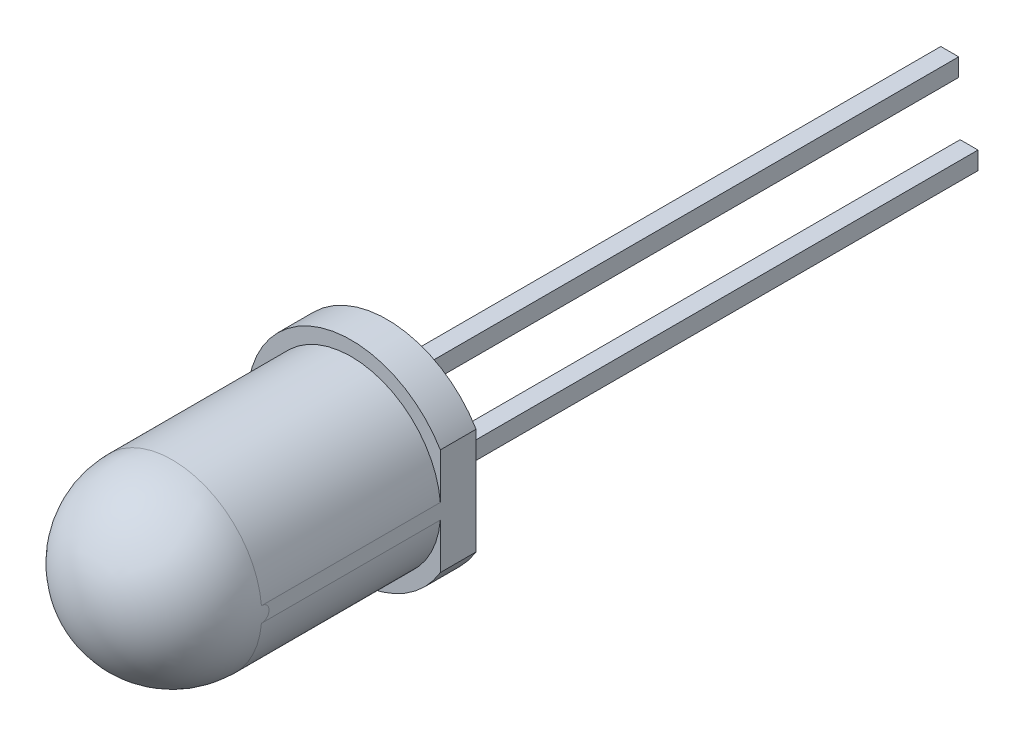
ISO-10303-21;
HEADER;
FILE_DESCRIPTION(('STEP AP214'),'2;1');
FILE_NAME('part.step','',(''),(''),'','','');
FILE_SCHEMA(('AUTOMOTIVE_DESIGN { 1 0 10303 214 1 1 1 1 }'));
ENDSEC;
DATA;
#1=APPLICATION_CONTEXT('core data for automotive mechanical design processes');
#2=APPLICATION_PROTOCOL_DEFINITION('international standard','automotive_design',2000,#1);
#3=PRODUCT_CONTEXT('',#1,'mechanical');
#4=PRODUCT('Part','Part','',(#3));
#5=PRODUCT_RELATED_PRODUCT_CATEGORY('part','',(#4));
#6=PRODUCT_DEFINITION_FORMATION('','',#4);
#7=PRODUCT_DEFINITION_CONTEXT('part definition',#1,'design');
#8=PRODUCT_DEFINITION('design','',#6,#7);
#9=PRODUCT_DEFINITION_SHAPE('','',#8);
#10=(LENGTH_UNIT() NAMED_UNIT(*) SI_UNIT(.MILLI.,.METRE.));
#11=(NAMED_UNIT(*) PLANE_ANGLE_UNIT() SI_UNIT($,.RADIAN.));
#12=(NAMED_UNIT(*) SI_UNIT($,.STERADIAN.) SOLID_ANGLE_UNIT());
#13=UNCERTAINTY_MEASURE_WITH_UNIT(LENGTH_MEASURE(1.E-05),#10,'distance_accuracy_value','');
#14=(GEOMETRIC_REPRESENTATION_CONTEXT(3) GLOBAL_UNCERTAINTY_ASSIGNED_CONTEXT((#13)) GLOBAL_UNIT_ASSIGNED_CONTEXT((#10,
#11,#12)) REPRESENTATION_CONTEXT('',''));
#15=CARTESIAN_POINT('',(0.,0.,0.));
#16=DIRECTION('',(0.,0.,1.));
#17=DIRECTION('',(1.,0.,0.));
#18=AXIS2_PLACEMENT_3D('',#15,#16,#17);
#19=CARTESIAN_POINT('',(-0.204530261149625,0.,17.));
#20=DIRECTION('',(0.,0.,1.));
#21=DIRECTION('',(1.,0.,0.));
#22=AXIS2_PLACEMENT_3D('',#19,#20,#21);
#23=PLANE('',#22);
#24=DIRECTION('',(0.,1.,0.));
#25=VECTOR('',#24,1.);
#26=CARTESIAN_POINT('',(1.51997090657932,0.129298151989421,17.));
#27=LINE('',#26,#25);
#28=CARTESIAN_POINT('',(1.51997090657932,-0.241403696021158,17.));
#29=VERTEX_POINT('',#28);
#30=CARTESIAN_POINT('',(1.51997090657932,0.258596303978842,17.));
#31=VERTEX_POINT('',#30);
#32=EDGE_CURVE('E257',#29,#31,#27,.T.);
#33=ORIENTED_EDGE('',*,*,#32,.T.);
#34=DIRECTION('',(-1.,0.,0.));
#35=VECTOR('',#34,1.);
#36=CARTESIAN_POINT('',(0.407720322714848,0.258596303978842,17.));
#37=LINE('',#36,#35);
#38=CARTESIAN_POINT('',(1.01997090657932,0.258596303978842,17.));
#39=VERTEX_POINT('',#38);
#40=EDGE_CURVE('E230',#31,#39,#37,.T.);
#41=ORIENTED_EDGE('',*,*,#40,.T.);
#42=DIRECTION('',(0.,-1.,0.));
#43=VECTOR('',#42,1.);
#44=CARTESIAN_POINT('',(1.01997090657932,-0.120701848010579,17.));
#45=LINE('',#44,#43);
#46=CARTESIAN_POINT('',(1.01997090657932,-0.241403696021158,17.));
#47=VERTEX_POINT('',#46);
#48=EDGE_CURVE('E195',#39,#47,#45,.T.);
#49=ORIENTED_EDGE('',*,*,#48,.T.);
#50=DIRECTION('',(1.,0.,0.));
#51=VECTOR('',#50,1.);
#52=CARTESIAN_POINT('',(0.657720322714848,-0.241403696021158,17.));
#53=LINE('',#52,#51);
#54=EDGE_CURVE('E185',#47,#29,#53,.T.);
#55=ORIENTED_EDGE('',*,*,#54,.T.);
#56=EDGE_LOOP('',(#33,#41,#49,#55));
#57=FACE_BOUND('',#56,.T.);
#58=DIRECTION('',(0.,-1.,0.));
#59=VECTOR('',#58,1.);
#60=CARTESIAN_POINT('',(-1.51999015986441,-0.127499692359835,17.));
#61=LINE('',#60,#59);
#62=CARTESIAN_POINT('',(-1.51999015986441,0.24500061528033,17.));
#63=VERTEX_POINT('',#62);
#64=CARTESIAN_POINT('',(-1.51999015986441,-0.25499938471967,17.));
#65=VERTEX_POINT('',#64);
#66=EDGE_CURVE('E176',#63,#65,#61,.T.);
#67=ORIENTED_EDGE('',*,*,#66,.T.);
#68=DIRECTION('',(1.,0.,0.));
#69=VECTOR('',#68,1.);
#70=CARTESIAN_POINT('',(-0.612260210507016,-0.25499938471967,17.));
#71=LINE('',#70,#69);
#72=CARTESIAN_POINT('',(-1.01999015986441,-0.25499938471967,17.));
#73=VERTEX_POINT('',#72);
#74=EDGE_CURVE('E214',#65,#73,#71,.T.);
#75=ORIENTED_EDGE('',*,*,#74,.T.);
#76=DIRECTION('',(0.,1.,0.));
#77=VECTOR('',#76,1.);
#78=CARTESIAN_POINT('',(-1.01999015986441,0.122500307640165,17.));
#79=LINE('',#78,#77);
#80=CARTESIAN_POINT('',(-1.01999015986441,0.24500061528033,17.));
#81=VERTEX_POINT('',#80);
#82=EDGE_CURVE('E246',#73,#81,#79,.T.);
#83=ORIENTED_EDGE('',*,*,#82,.T.);
#84=DIRECTION('',(-1.,0.,0.));
#85=VECTOR('',#84,1.);
#86=CARTESIAN_POINT('',(-0.862260210507016,0.24500061528033,17.));
#87=LINE('',#86,#85);
#88=EDGE_CURVE('E262',#81,#63,#87,.T.);
#89=ORIENTED_EDGE('',*,*,#88,.T.);
#90=EDGE_LOOP('',(#67,#75,#83,#89));
#91=FACE_BOUND('',#90,.T.);
#92=CARTESIAN_POINT('',(0.,0.,17.));
#93=DIRECTION('',(0.,0.,1.));
#94=DIRECTION('',(1.,0.,0.));
#95=AXIS2_PLACEMENT_3D('',#92,#93,#94);
#96=CIRCLE('',#95,2.9);
#97=CARTESIAN_POINT('',(2.49093947770075,1.48499849105375,17.));
#98=VERTEX_POINT('',#97);
#99=CARTESIAN_POINT('',(2.49093947770075,-1.48499849105375,17.));
#100=VERTEX_POINT('',#99);
#101=EDGE_CURVE('E10',#98,#100,#96,.T.);
#102=ORIENTED_EDGE('',*,*,#101,.F.);
#103=DIRECTION('',(0.,1.,0.));
#104=VECTOR('',#103,1.);
#105=CARTESIAN_POINT('',(2.49093947770075,-2.49999994412065,17.));
#106=LINE('',#105,#104);
#107=EDGE_CURVE('E179',#100,#98,#106,.T.);
#108=ORIENTED_EDGE('',*,*,#107,.F.);
#109=EDGE_LOOP('',(#102,#108));
#110=FACE_BOUND('',#109,.T.);
#111=ADVANCED_FACE('F16',(#57,#91,#110),#23,.F.);
#112=CARTESIAN_POINT('',(0.,0.,17.));
#113=DIRECTION('',(0.,0.,1.));
#114=DIRECTION('',(-1.,0.,0.));
#115=AXIS2_PLACEMENT_3D('',#112,#113,#114);
#116=CYLINDRICAL_SURFACE('',#115,2.9);
#117=ORIENTED_EDGE('',*,*,#101,.T.);
#118=DIRECTION('',(0.,0.,1.));
#119=VECTOR('',#118,1.);
#120=CARTESIAN_POINT('',(2.49093947770075,-1.48499849105375,17.));
#121=LINE('',#120,#119);
#122=CARTESIAN_POINT('',(2.49093947770075,-1.48499849105375,18.));
#123=VERTEX_POINT('',#122);
#124=EDGE_CURVE('E156',#100,#123,#121,.T.);
#125=ORIENTED_EDGE('',*,*,#124,.T.);
#126=CARTESIAN_POINT('',(0.,0.,18.));
#127=DIRECTION('',(0.,0.,1.));
#128=DIRECTION('',(1.,0.,0.));
#129=AXIS2_PLACEMENT_3D('',#126,#127,#128);
#130=CIRCLE('',#129,2.9);
#131=CARTESIAN_POINT('',(2.49093947770075,1.48499849105375,18.));
#132=VERTEX_POINT('',#131);
#133=EDGE_CURVE('E153',#132,#123,#130,.T.);
#134=ORIENTED_EDGE('',*,*,#133,.F.);
#135=DIRECTION('',(0.,0.,1.));
#136=VECTOR('',#135,1.);
#137=CARTESIAN_POINT('',(2.49093947770075,1.48499849105375,17.));
#138=LINE('',#137,#136);
#139=EDGE_CURVE('E26',#98,#132,#138,.T.);
#140=ORIENTED_EDGE('',*,*,#139,.F.);
#141=EDGE_LOOP('',(#117,#125,#134,#140));
#142=FACE_BOUND('',#141,.T.);
#143=ADVANCED_FACE('F225',(#142),#116,.T.);
#144=CARTESIAN_POINT('',(2.49093947770075,-1.48499849105375,17.));
#145=DIRECTION('',(1.,0.,0.));
#146=DIRECTION('',(0.,1.,0.));
#147=AXIS2_PLACEMENT_3D('',#144,#145,#146);
#148=PLANE('',#147);
#149=CARTESIAN_POINT('',(2.49093947770075,0.,23.));
#150=DIRECTION('',(-1.,0.,0.));
#151=DIRECTION('',(0.,0.,1.));
#152=AXIS2_PLACEMENT_3D('',#149,#150,#151);
#153=CIRCLE('',#152,0.212651166072309);
#154=CARTESIAN_POINT('',(2.49093947770075,0.212651166072291,23.));
#155=VERTEX_POINT('',#154);
#156=CARTESIAN_POINT('',(2.49093947770075,-0.212651166072285,23.));
#157=VERTEX_POINT('',#156);
#158=EDGE_CURVE('E160',#155,#157,#153,.T.);
#159=ORIENTED_EDGE('',*,*,#158,.T.);
#160=DIRECTION('',(0.,0.,1.));
#161=VECTOR('',#160,1.);
#162=CARTESIAN_POINT('',(2.49093947770075,-0.212651166072285,18.));
#163=LINE('',#162,#161);
#164=CARTESIAN_POINT('',(2.49093947770075,-0.212651166072285,18.));
#165=VERTEX_POINT('',#164);
#166=EDGE_CURVE('E158',#165,#157,#163,.T.);
#167=ORIENTED_EDGE('',*,*,#166,.F.);
#168=DIRECTION('',(0.,1.,0.));
#169=VECTOR('',#168,1.);
#170=CARTESIAN_POINT('',(2.49093947770075,-2.49999994412065,18.));
#171=LINE('',#170,#169);
#172=EDGE_CURVE('E146',#123,#165,#171,.T.);
#173=ORIENTED_EDGE('',*,*,#172,.F.);
#174=ORIENTED_EDGE('',*,*,#124,.F.);
#175=ORIENTED_EDGE('',*,*,#107,.T.);
#176=ORIENTED_EDGE('',*,*,#139,.T.);
#177=DIRECTION('',(0.,1.,0.));
#178=VECTOR('',#177,1.);
#179=CARTESIAN_POINT('',(2.49093947770075,-2.49999994412065,18.));
#180=LINE('',#179,#178);
#181=CARTESIAN_POINT('',(2.49093947770075,0.212651166072291,18.));
#182=VERTEX_POINT('',#181);
#183=EDGE_CURVE('E181',#182,#132,#180,.T.);
#184=ORIENTED_EDGE('',*,*,#183,.F.);
#185=DIRECTION('',(0.,0.,1.));
#186=VECTOR('',#185,1.);
#187=CARTESIAN_POINT('',(2.49093947770075,0.212651166072291,18.));
#188=LINE('',#187,#186);
#189=EDGE_CURVE('E115',#182,#155,#188,.T.);
#190=ORIENTED_EDGE('',*,*,#189,.T.);
#191=EDGE_LOOP('',(#159,#167,#173,#174,#175,#176,#184,#190));
#192=FACE_BOUND('',#191,.T.);
#193=ADVANCED_FACE('F159',(#192),#148,.T.);
#194=CARTESIAN_POINT('',(-0.204530261149625,0.,18.));
#195=DIRECTION('',(0.,0.,1.));
#196=DIRECTION('',(1.,0.,0.));
#197=AXIS2_PLACEMENT_3D('',#194,#195,#196);
#198=PLANE('',#197);
#199=CARTESIAN_POINT('',(0.,0.,18.));
#200=DIRECTION('',(0.,0.,-1.));
#201=DIRECTION('',(-1.,0.,0.));
#202=AXIS2_PLACEMENT_3D('',#199,#200,#201);
#203=CIRCLE('',#202,2.5);
#204=EDGE_CURVE('E151',#165,#182,#203,.T.);
#205=ORIENTED_EDGE('',*,*,#204,.T.);
#206=ORIENTED_EDGE('',*,*,#183,.T.);
#207=ORIENTED_EDGE('',*,*,#133,.T.);
#208=ORIENTED_EDGE('',*,*,#172,.T.);
#209=EDGE_LOOP('',(#205,#206,#207,#208));
#210=FACE_BOUND('',#209,.T.);
#211=ADVANCED_FACE('F148',(#210),#198,.T.);
#212=CARTESIAN_POINT('',(0.,0.,18.));
#213=DIRECTION('',(0.,0.,1.));
#214=DIRECTION('',(-1.,0.,0.));
#215=AXIS2_PLACEMENT_3D('',#212,#213,#214);
#216=CYLINDRICAL_SURFACE('',#215,2.5);
#217=ORIENTED_EDGE('',*,*,#204,.F.);
#218=ORIENTED_EDGE('',*,*,#166,.T.);
#219=CARTESIAN_POINT('',(0.,0.,23.));
#220=DIRECTION('',(0.,0.,1.));
#221=DIRECTION('',(-1.,0.,0.));
#222=AXIS2_PLACEMENT_3D('',#219,#220,#221);
#223=CIRCLE('',#222,2.5);
#224=CARTESIAN_POINT('',(-2.5,0.,23.));
#225=VERTEX_POINT('',#224);
#226=EDGE_CURVE('E126',#225,#157,#223,.T.);
#227=ORIENTED_EDGE('',*,*,#226,.F.);
#228=CARTESIAN_POINT('',(0.,0.,23.));
#229=DIRECTION('',(0.,0.,1.));
#230=DIRECTION('',(-1.,0.,0.));
#231=AXIS2_PLACEMENT_3D('',#228,#229,#230);
#232=CIRCLE('',#231,2.5);
#233=EDGE_CURVE('E208',#155,#225,#232,.T.);
#234=ORIENTED_EDGE('',*,*,#233,.F.);
#235=ORIENTED_EDGE('',*,*,#189,.F.);
#236=EDGE_LOOP('',(#217,#218,#227,#234,#235));
#237=FACE_BOUND('',#236,.T.);
#238=ADVANCED_FACE('F163',(#237),#216,.T.);
#239=CARTESIAN_POINT('',(0.,0.,23.));
#240=DIRECTION('',(0.,0.,1.));
#241=DIRECTION('',(1.,0.,0.));
#242=AXIS2_PLACEMENT_3D('',#239,#240,#241);
#243=SPHERICAL_SURFACE('',#242,2.5);
#244=ORIENTED_EDGE('',*,*,#233,.T.);
#245=CARTESIAN_POINT('',(0.,0.,23.));
#246=DIRECTION('',(0.,-1.,0.));
#247=DIRECTION('',(-1.,0.,0.));
#248=AXIS2_PLACEMENT_3D('',#245,#246,#247);
#249=CIRCLE('',#248,2.5);
#250=CARTESIAN_POINT('',(0.,0.,25.5));
#251=VERTEX_POINT('',#250);
#252=EDGE_CURVE('E206',#251,#225,#249,.T.);
#253=ORIENTED_EDGE('',*,*,#252,.F.);
#254=ORIENTED_EDGE('',*,*,#252,.T.);
#255=ORIENTED_EDGE('',*,*,#226,.T.);
#256=ORIENTED_EDGE('',*,*,#158,.F.);
#257=EDGE_LOOP('',(#244,#253,#254,#255,#256));
#258=FACE_BOUND('',#257,.T.);
#259=ADVANCED_FACE('F362',(#258),#243,.T.);
#260=CARTESIAN_POINT('',(1.26997090657932,0.00859630397884229,2.));
#261=DIRECTION('',(0.,0.,-1.));
#262=DIRECTION('',(0.,-1.,0.));
#263=AXIS2_PLACEMENT_3D('',#260,#261,#262);
#264=PLANE('',#263);
#265=DIRECTION('',(-1.,0.,0.));
#266=VECTOR('',#265,1.);
#267=CARTESIAN_POINT('',(1.01997090657932,-0.241403696021158,2.));
#268=LINE('',#267,#266);
#269=CARTESIAN_POINT('',(1.51997090657932,-0.241403696021158,2.));
#270=VERTEX_POINT('',#269);
#271=CARTESIAN_POINT('',(1.01997090657932,-0.241403696021158,2.));
#272=VERTEX_POINT('',#271);
#273=EDGE_CURVE('E19',#270,#272,#268,.T.);
#274=ORIENTED_EDGE('',*,*,#273,.T.);
#275=DIRECTION('',(0.,1.,0.));
#276=VECTOR('',#275,1.);
#277=CARTESIAN_POINT('',(1.01997090657932,0.258596303978842,2.));
#278=LINE('',#277,#276);
#279=CARTESIAN_POINT('',(1.01997090657932,0.258596303978842,2.));
#280=VERTEX_POINT('',#279);
#281=EDGE_CURVE('E186',#272,#280,#278,.T.);
#282=ORIENTED_EDGE('',*,*,#281,.T.);
#283=DIRECTION('',(1.,0.,0.));
#284=VECTOR('',#283,1.);
#285=CARTESIAN_POINT('',(1.51997090657932,0.258596303978842,2.));
#286=LINE('',#285,#284);
#287=CARTESIAN_POINT('',(1.51997090657932,0.258596303978842,2.));
#288=VERTEX_POINT('',#287);
#289=EDGE_CURVE('E234',#280,#288,#286,.T.);
#290=ORIENTED_EDGE('',*,*,#289,.T.);
#291=DIRECTION('',(0.,-1.,0.));
#292=VECTOR('',#291,1.);
#293=CARTESIAN_POINT('',(1.51997090657932,-0.241403696021158,2.));
#294=LINE('',#293,#292);
#295=EDGE_CURVE('E256',#288,#270,#294,.T.);
#296=ORIENTED_EDGE('',*,*,#295,.T.);
#297=EDGE_LOOP('',(#274,#282,#290,#296));
#298=FACE_BOUND('',#297,.T.);
#299=ADVANCED_FACE('F351',(#298),#264,.T.);
#300=CARTESIAN_POINT('',(1.51997090657932,-0.241403696021158,17.));
#301=DIRECTION('',(0.,-1.,0.));
#302=DIRECTION('',(0.,0.,-1.));
#303=AXIS2_PLACEMENT_3D('',#300,#301,#302);
#304=PLANE('',#303);
#305=ORIENTED_EDGE('',*,*,#54,.F.);
#306=DIRECTION('',(0.,0.,-1.));
#307=VECTOR('',#306,1.);
#308=CARTESIAN_POINT('',(1.01997090657932,-0.241403696021158,17.));
#309=LINE('',#308,#307);
#310=EDGE_CURVE('E182',#47,#272,#309,.T.);
#311=ORIENTED_EDGE('',*,*,#310,.T.);
#312=ORIENTED_EDGE('',*,*,#273,.F.);
#313=DIRECTION('',(0.,0.,-1.));
#314=VECTOR('',#313,1.);
#315=CARTESIAN_POINT('',(1.51997090657932,-0.241403696021158,17.));
#316=LINE('',#315,#314);
#317=EDGE_CURVE('E261',#29,#270,#316,.T.);
#318=ORIENTED_EDGE('',*,*,#317,.F.);
#319=EDGE_LOOP('',(#305,#311,#312,#318));
#320=FACE_BOUND('',#319,.T.);
#321=ADVANCED_FACE('F344',(#320),#304,.T.);
#322=CARTESIAN_POINT('',(1.01997090657932,-0.241403696021158,17.));
#323=DIRECTION('',(-1.,0.,0.));
#324=DIRECTION('',(0.,0.,1.));
#325=AXIS2_PLACEMENT_3D('',#322,#323,#324);
#326=PLANE('',#325);
#327=ORIENTED_EDGE('',*,*,#48,.F.);
#328=DIRECTION('',(0.,0.,-1.));
#329=VECTOR('',#328,1.);
#330=CARTESIAN_POINT('',(1.01997090657932,0.258596303978842,17.));
#331=LINE('',#330,#329);
#332=EDGE_CURVE('E202',#39,#280,#331,.T.);
#333=ORIENTED_EDGE('',*,*,#332,.T.);
#334=ORIENTED_EDGE('',*,*,#281,.F.);
#335=ORIENTED_EDGE('',*,*,#310,.F.);
#336=EDGE_LOOP('',(#327,#333,#334,#335));
#337=FACE_BOUND('',#336,.T.);
#338=ADVANCED_FACE('F342',(#337),#326,.T.);
#339=CARTESIAN_POINT('',(1.01997090657932,0.258596303978842,17.));
#340=DIRECTION('',(0.,1.,0.));
#341=DIRECTION('',(1.,0.,0.));
#342=AXIS2_PLACEMENT_3D('',#339,#340,#341);
#343=PLANE('',#342);
#344=ORIENTED_EDGE('',*,*,#40,.F.);
#345=DIRECTION('',(0.,0.,-1.));
#346=VECTOR('',#345,1.);
#347=CARTESIAN_POINT('',(1.51997090657932,0.258596303978842,17.));
#348=LINE('',#347,#346);
#349=EDGE_CURVE('E235',#31,#288,#348,.T.);
#350=ORIENTED_EDGE('',*,*,#349,.T.);
#351=ORIENTED_EDGE('',*,*,#289,.F.);
#352=ORIENTED_EDGE('',*,*,#332,.F.);
#353=EDGE_LOOP('',(#344,#350,#351,#352));
#354=FACE_BOUND('',#353,.T.);
#355=ADVANCED_FACE('F339',(#354),#343,.T.);
#356=CARTESIAN_POINT('',(1.51997090657932,0.258596303978842,17.));
#357=DIRECTION('',(1.,0.,0.));
#358=DIRECTION('',(0.,1.,0.));
#359=AXIS2_PLACEMENT_3D('',#356,#357,#358);
#360=PLANE('',#359);
#361=ORIENTED_EDGE('',*,*,#32,.F.);
#362=ORIENTED_EDGE('',*,*,#317,.T.);
#363=ORIENTED_EDGE('',*,*,#295,.F.);
#364=ORIENTED_EDGE('',*,*,#349,.F.);
#365=EDGE_LOOP('',(#361,#362,#363,#364));
#366=FACE_BOUND('',#365,.T.);
#367=ADVANCED_FACE('F319',(#366),#360,.T.);
#368=CARTESIAN_POINT('',(-1.51999015986441,0.24500061528033,17.));
#369=DIRECTION('',(0.,1.,0.));
#370=DIRECTION('',(1.,0.,0.));
#371=AXIS2_PLACEMENT_3D('',#368,#369,#370);
#372=PLANE('',#371);
#373=ORIENTED_EDGE('',*,*,#88,.F.);
#374=DIRECTION('',(0.,0.,-1.));
#375=VECTOR('',#374,1.);
#376=CARTESIAN_POINT('',(-1.01999015986441,0.24500061528033,17.));
#377=LINE('',#376,#375);
#378=CARTESIAN_POINT('',(-1.01999015986441,0.24500061528033,0.));
#379=VERTEX_POINT('',#378);
#380=EDGE_CURVE('E271',#81,#379,#377,.T.);
#381=ORIENTED_EDGE('',*,*,#380,.T.);
#382=DIRECTION('',(1.,0.,0.));
#383=VECTOR('',#382,1.);
#384=CARTESIAN_POINT('',(-1.01999015986441,0.24500061528033,0.));
#385=LINE('',#384,#383);
#386=CARTESIAN_POINT('',(-1.51999015986441,0.24500061528033,0.));
#387=VERTEX_POINT('',#386);
#388=EDGE_CURVE('E263',#387,#379,#385,.T.);
#389=ORIENTED_EDGE('',*,*,#388,.F.);
#390=DIRECTION('',(0.,0.,-1.));
#391=VECTOR('',#390,1.);
#392=CARTESIAN_POINT('',(-1.51999015986441,0.24500061528033,17.));
#393=LINE('',#392,#391);
#394=EDGE_CURVE('E172',#63,#387,#393,.T.);
#395=ORIENTED_EDGE('',*,*,#394,.F.);
#396=EDGE_LOOP('',(#373,#381,#389,#395));
#397=FACE_BOUND('',#396,.T.);
#398=ADVANCED_FACE('F304',(#397),#372,.T.);
#399=CARTESIAN_POINT('',(-1.01999015986441,0.24500061528033,17.));
#400=DIRECTION('',(1.,0.,0.));
#401=DIRECTION('',(0.,1.,0.));
#402=AXIS2_PLACEMENT_3D('',#399,#400,#401);
#403=PLANE('',#402);
#404=ORIENTED_EDGE('',*,*,#82,.F.);
#405=DIRECTION('',(0.,0.,-1.));
#406=VECTOR('',#405,1.);
#407=CARTESIAN_POINT('',(-1.01999015986441,-0.25499938471967,17.));
#408=LINE('',#407,#406);
#409=CARTESIAN_POINT('',(-1.01999015986441,-0.25499938471967,0.));
#410=VERTEX_POINT('',#409);
#411=EDGE_CURVE('E244',#73,#410,#408,.T.);
#412=ORIENTED_EDGE('',*,*,#411,.T.);
#413=DIRECTION('',(0.,-1.,0.));
#414=VECTOR('',#413,1.);
#415=CARTESIAN_POINT('',(-1.01999015986441,-0.25499938471967,0.));
#416=LINE('',#415,#414);
#417=EDGE_CURVE('E267',#379,#410,#416,.T.);
#418=ORIENTED_EDGE('',*,*,#417,.F.);
#419=ORIENTED_EDGE('',*,*,#380,.F.);
#420=EDGE_LOOP('',(#404,#412,#418,#419));
#421=FACE_BOUND('',#420,.T.);
#422=ADVANCED_FACE('F310',(#421),#403,.T.);
#423=CARTESIAN_POINT('',(-1.01999015986441,-0.25499938471967,17.));
#424=DIRECTION('',(0.,-1.,0.));
#425=DIRECTION('',(0.,0.,-1.));
#426=AXIS2_PLACEMENT_3D('',#423,#424,#425);
#427=PLANE('',#426);
#428=ORIENTED_EDGE('',*,*,#74,.F.);
#429=DIRECTION('',(0.,0.,-1.));
#430=VECTOR('',#429,1.);
#431=CARTESIAN_POINT('',(-1.51999015986441,-0.25499938471967,17.));
#432=LINE('',#431,#430);
#433=CARTESIAN_POINT('',(-1.51999015986441,-0.25499938471967,0.));
#434=VERTEX_POINT('',#433);
#435=EDGE_CURVE('E175',#65,#434,#432,.T.);
#436=ORIENTED_EDGE('',*,*,#435,.T.);
#437=DIRECTION('',(-1.,0.,0.));
#438=VECTOR('',#437,1.);
#439=CARTESIAN_POINT('',(-1.51999015986441,-0.25499938471967,0.));
#440=LINE('',#439,#438);
#441=EDGE_CURVE('E239',#410,#434,#440,.T.);
#442=ORIENTED_EDGE('',*,*,#441,.F.);
#443=ORIENTED_EDGE('',*,*,#411,.F.);
#444=EDGE_LOOP('',(#428,#436,#442,#443));
#445=FACE_BOUND('',#444,.T.);
#446=ADVANCED_FACE('F297',(#445),#427,.T.);
#447=CARTESIAN_POINT('',(-1.51999015986441,-0.25499938471967,17.));
#448=DIRECTION('',(-1.,0.,0.));
#449=DIRECTION('',(0.,0.,1.));
#450=AXIS2_PLACEMENT_3D('',#447,#448,#449);
#451=PLANE('',#450);
#452=ORIENTED_EDGE('',*,*,#66,.F.);
#453=ORIENTED_EDGE('',*,*,#394,.T.);
#454=DIRECTION('',(0.,1.,0.));
#455=VECTOR('',#454,1.);
#456=CARTESIAN_POINT('',(-1.51999015986441,0.24500061528033,0.));
#457=LINE('',#456,#455);
#458=EDGE_CURVE('E221',#434,#387,#457,.T.);
#459=ORIENTED_EDGE('',*,*,#458,.F.);
#460=ORIENTED_EDGE('',*,*,#435,.F.);
#461=EDGE_LOOP('',(#452,#453,#459,#460));
#462=FACE_BOUND('',#461,.T.);
#463=ADVANCED_FACE('F301',(#462),#451,.T.);
#464=CARTESIAN_POINT('',(-1.26999015986441,-0.00499938471966967,0.));
#465=DIRECTION('',(0.,0.,-1.));
#466=DIRECTION('',(0.,-1.,0.));
#467=AXIS2_PLACEMENT_3D('',#464,#465,#466);
#468=PLANE('',#467);
#469=ORIENTED_EDGE('',*,*,#388,.T.);
#470=ORIENTED_EDGE('',*,*,#417,.T.);
#471=ORIENTED_EDGE('',*,*,#441,.T.);
#472=ORIENTED_EDGE('',*,*,#458,.T.);
#473=EDGE_LOOP('',(#469,#470,#471,#472));
#474=FACE_BOUND('',#473,.T.);
#475=ADVANCED_FACE('F291',(#474),#468,.T.);
#476=CLOSED_SHELL('',(#111,#143,#193,#211,#238,#259,#299,#321,#338,#355,#367,#398,#422,#446,
#463,#475));
#477=MANIFOLD_SOLID_BREP('B1',#476);
#478=ADVANCED_BREP_SHAPE_REPRESENTATION('',(#18,#477),#14);
#479=SHAPE_DEFINITION_REPRESENTATION(#9,#478);
ENDSEC;
END-ISO-10303-21;
